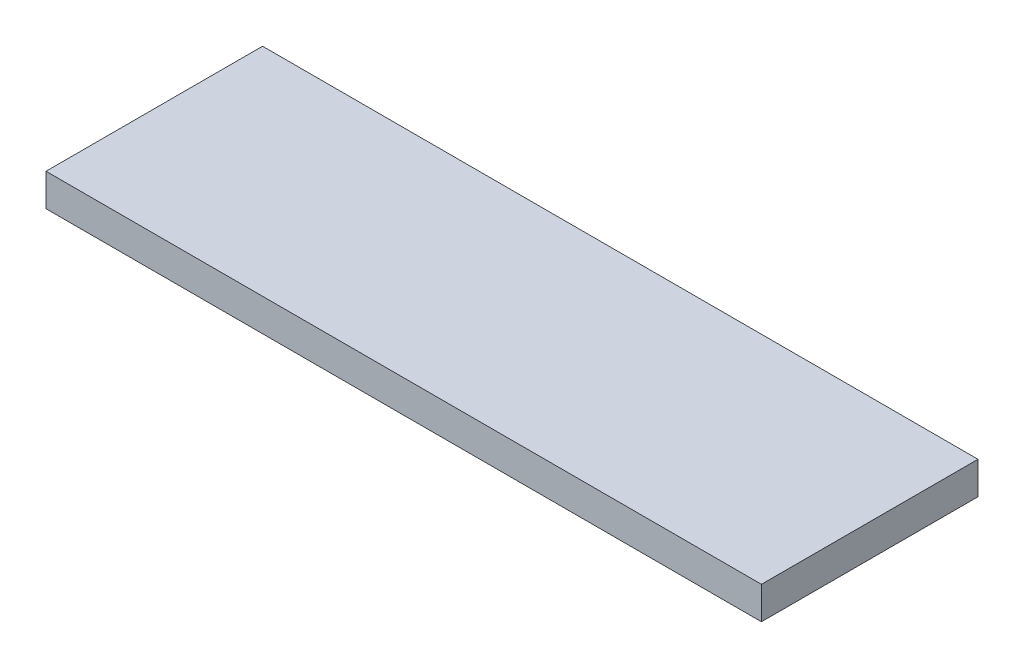
ISO-10303-21;
HEADER;
FILE_DESCRIPTION(('STEP AP214'),'2;1');
FILE_NAME('part.step','',(''),(''),'','','');
FILE_SCHEMA(('AUTOMOTIVE_DESIGN { 1 0 10303 214 1 1 1 1 }'));
ENDSEC;
DATA;
#1=APPLICATION_CONTEXT('core data for automotive mechanical design processes');
#2=APPLICATION_PROTOCOL_DEFINITION('international standard','automotive_design',2000,#1);
#3=PRODUCT_CONTEXT('',#1,'mechanical');
#4=PRODUCT('Part','Part','',(#3));
#5=PRODUCT_RELATED_PRODUCT_CATEGORY('part','',(#4));
#6=PRODUCT_DEFINITION_FORMATION('','',#4);
#7=PRODUCT_DEFINITION_CONTEXT('part definition',#1,'design');
#8=PRODUCT_DEFINITION('design','',#6,#7);
#9=PRODUCT_DEFINITION_SHAPE('','',#8);
#10=(LENGTH_UNIT() NAMED_UNIT(*) SI_UNIT(.MILLI.,.METRE.));
#11=(NAMED_UNIT(*) PLANE_ANGLE_UNIT() SI_UNIT($,.RADIAN.));
#12=(NAMED_UNIT(*) SI_UNIT($,.STERADIAN.) SOLID_ANGLE_UNIT());
#13=UNCERTAINTY_MEASURE_WITH_UNIT(LENGTH_MEASURE(1.E-05),#10,'distance_accuracy_value','');
#14=(GEOMETRIC_REPRESENTATION_CONTEXT(3) GLOBAL_UNCERTAINTY_ASSIGNED_CONTEXT((#13)) GLOBAL_UNIT_ASSIGNED_CONTEXT((#10,
#11,#12)) REPRESENTATION_CONTEXT('',''));
#15=CARTESIAN_POINT('',(0.,0.,0.));
#16=DIRECTION('',(0.,0.,1.));
#17=DIRECTION('',(1.,0.,0.));
#18=AXIS2_PLACEMENT_3D('',#15,#16,#17);
#19=CARTESIAN_POINT('',(33.02,2.9972,-9.9949));
#20=DIRECTION('',(-1.,0.,0.));
#21=DIRECTION('',(0.,0.,1.));
#22=AXIS2_PLACEMENT_3D('',#19,#20,#21);
#23=PLANE('',#22);
#24=DIRECTION('',(0.,0.,-1.));
#25=VECTOR('',#24,1.);
#26=CARTESIAN_POINT('',(33.02,0.,-9.9949));
#27=LINE('',#26,#25);
#28=CARTESIAN_POINT('',(33.02,0.,9.9949));
#29=VERTEX_POINT('',#28);
#30=CARTESIAN_POINT('',(33.02,0.,-9.9949));
#31=VERTEX_POINT('',#30);
#32=EDGE_CURVE('E107',#29,#31,#27,.T.);
#33=ORIENTED_EDGE('',*,*,#32,.T.);
#34=DIRECTION('',(0.,-1.,0.));
#35=VECTOR('',#34,1.);
#36=CARTESIAN_POINT('',(33.02,2.9972,-9.9949));
#37=LINE('',#36,#35);
#38=CARTESIAN_POINT('',(33.02,2.9972,-9.9949));
#39=VERTEX_POINT('',#38);
#40=EDGE_CURVE('E11',#39,#31,#37,.T.);
#41=ORIENTED_EDGE('',*,*,#40,.F.);
#42=DIRECTION('',(0.,0.,-1.));
#43=VECTOR('',#42,1.);
#44=CARTESIAN_POINT('',(33.02,2.9972,-9.9949));
#45=LINE('',#44,#43);
#46=CARTESIAN_POINT('',(33.02,2.9972,9.9949));
#47=VERTEX_POINT('',#46);
#48=EDGE_CURVE('E91',#47,#39,#45,.T.);
#49=ORIENTED_EDGE('',*,*,#48,.F.);
#50=DIRECTION('',(0.,-1.,0.));
#51=VECTOR('',#50,1.);
#52=CARTESIAN_POINT('',(33.02,2.9972,9.9949));
#53=LINE('',#52,#51);
#54=EDGE_CURVE('E103',#47,#29,#53,.T.);
#55=ORIENTED_EDGE('',*,*,#54,.T.);
#56=EDGE_LOOP('',(#33,#41,#49,#55));
#57=FACE_BOUND('',#56,.T.);
#58=ADVANCED_FACE('F39',(#57),#23,.F.);
#59=CARTESIAN_POINT('',(-33.02,2.9972,-9.9949));
#60=DIRECTION('',(0.,0.,1.));
#61=DIRECTION('',(1.,0.,0.));
#62=AXIS2_PLACEMENT_3D('',#59,#60,#61);
#63=PLANE('',#62);
#64=DIRECTION('',(-1.,0.,0.));
#65=VECTOR('',#64,1.);
#66=CARTESIAN_POINT('',(-33.02,0.,-9.9949));
#67=LINE('',#66,#65);
#68=CARTESIAN_POINT('',(-33.02,0.,-9.9949));
#69=VERTEX_POINT('',#68);
#70=EDGE_CURVE('E96',#31,#69,#67,.T.);
#71=ORIENTED_EDGE('',*,*,#70,.T.);
#72=DIRECTION('',(0.,-1.,0.));
#73=VECTOR('',#72,1.);
#74=CARTESIAN_POINT('',(-33.02,2.9972,-9.9949));
#75=LINE('',#74,#73);
#76=CARTESIAN_POINT('',(-33.02,2.9972,-9.9949));
#77=VERTEX_POINT('',#76);
#78=EDGE_CURVE('E48',#77,#69,#75,.T.);
#79=ORIENTED_EDGE('',*,*,#78,.F.);
#80=DIRECTION('',(-1.,0.,0.));
#81=VECTOR('',#80,1.);
#82=CARTESIAN_POINT('',(-33.02,2.9972,-9.9949));
#83=LINE('',#82,#81);
#84=EDGE_CURVE('E86',#39,#77,#83,.T.);
#85=ORIENTED_EDGE('',*,*,#84,.F.);
#86=ORIENTED_EDGE('',*,*,#40,.T.);
#87=EDGE_LOOP('',(#71,#79,#85,#86));
#88=FACE_BOUND('',#87,.T.);
#89=ADVANCED_FACE('F95',(#88),#63,.F.);
#90=CARTESIAN_POINT('',(-33.02,2.9972,-9.9949));
#91=DIRECTION('',(1.,0.,0.));
#92=DIRECTION('',(0.,0.,-1.));
#93=AXIS2_PLACEMENT_3D('',#90,#91,#92);
#94=PLANE('',#93);
#95=DIRECTION('',(0.,0.,1.));
#96=VECTOR('',#95,1.);
#97=CARTESIAN_POINT('',(-33.02,0.,-9.9949));
#98=LINE('',#97,#96);
#99=CARTESIAN_POINT('',(-33.02,0.,9.9949));
#100=VERTEX_POINT('',#99);
#101=EDGE_CURVE('E73',#69,#100,#98,.T.);
#102=ORIENTED_EDGE('',*,*,#101,.T.);
#103=DIRECTION('',(0.,-1.,0.));
#104=VECTOR('',#103,1.);
#105=CARTESIAN_POINT('',(-33.02,2.9972,9.9949));
#106=LINE('',#105,#104);
#107=CARTESIAN_POINT('',(-33.02,2.9972,9.9949));
#108=VERTEX_POINT('',#107);
#109=EDGE_CURVE('E98',#108,#100,#106,.T.);
#110=ORIENTED_EDGE('',*,*,#109,.F.);
#111=DIRECTION('',(0.,0.,1.));
#112=VECTOR('',#111,1.);
#113=CARTESIAN_POINT('',(-33.02,2.9972,-9.9949));
#114=LINE('',#113,#112);
#115=EDGE_CURVE('E89',#77,#108,#114,.T.);
#116=ORIENTED_EDGE('',*,*,#115,.F.);
#117=ORIENTED_EDGE('',*,*,#78,.T.);
#118=EDGE_LOOP('',(#102,#110,#116,#117));
#119=FACE_BOUND('',#118,.T.);
#120=ADVANCED_FACE('F99',(#119),#94,.F.);
#121=CARTESIAN_POINT('',(-33.02,2.9972,9.9949));
#122=DIRECTION('',(0.,0.,-1.));
#123=DIRECTION('',(-1.,0.,0.));
#124=AXIS2_PLACEMENT_3D('',#121,#122,#123);
#125=PLANE('',#124);
#126=DIRECTION('',(1.,0.,0.));
#127=VECTOR('',#126,1.);
#128=CARTESIAN_POINT('',(-33.02,0.,9.9949));
#129=LINE('',#128,#127);
#130=EDGE_CURVE('E79',#100,#29,#129,.T.);
#131=ORIENTED_EDGE('',*,*,#130,.T.);
#132=ORIENTED_EDGE('',*,*,#54,.F.);
#133=DIRECTION('',(1.,0.,0.));
#134=VECTOR('',#133,1.);
#135=CARTESIAN_POINT('',(-33.02,2.9972,9.9949));
#136=LINE('',#135,#134);
#137=EDGE_CURVE('E56',#108,#47,#136,.T.);
#138=ORIENTED_EDGE('',*,*,#137,.F.);
#139=ORIENTED_EDGE('',*,*,#109,.T.);
#140=EDGE_LOOP('',(#131,#132,#138,#139));
#141=FACE_BOUND('',#140,.T.);
#142=ADVANCED_FACE('F120',(#141),#125,.F.);
#143=CARTESIAN_POINT('',(0.,2.9972,0.));
#144=DIRECTION('',(0.,1.,0.));
#145=DIRECTION('',(0.,0.,1.));
#146=AXIS2_PLACEMENT_3D('',#143,#144,#145);
#147=PLANE('',#146);
#148=ORIENTED_EDGE('',*,*,#48,.T.);
#149=ORIENTED_EDGE('',*,*,#84,.T.);
#150=ORIENTED_EDGE('',*,*,#115,.T.);
#151=ORIENTED_EDGE('',*,*,#137,.T.);
#152=EDGE_LOOP('',(#148,#149,#150,#151));
#153=FACE_BOUND('',#152,.T.);
#154=ADVANCED_FACE('F87',(#153),#147,.T.);
#155=CARTESIAN_POINT('',(0.,0.,0.));
#156=DIRECTION('',(0.,1.,0.));
#157=DIRECTION('',(0.,0.,1.));
#158=AXIS2_PLACEMENT_3D('',#155,#156,#157);
#159=PLANE('',#158);
#160=ORIENTED_EDGE('',*,*,#32,.F.);
#161=ORIENTED_EDGE('',*,*,#130,.F.);
#162=ORIENTED_EDGE('',*,*,#101,.F.);
#163=ORIENTED_EDGE('',*,*,#70,.F.);
#164=EDGE_LOOP('',(#160,#161,#162,#163));
#165=FACE_BOUND('',#164,.T.);
#166=ADVANCED_FACE('F123',(#165),#159,.F.);
#167=CLOSED_SHELL('',(#58,#89,#120,#142,#154,#166));
#168=MANIFOLD_SOLID_BREP('B2',#167);
#169=ADVANCED_BREP_SHAPE_REPRESENTATION('',(#18,#168),#14);
#170=SHAPE_DEFINITION_REPRESENTATION(#9,#169);
ENDSEC;
END-ISO-10303-21;
